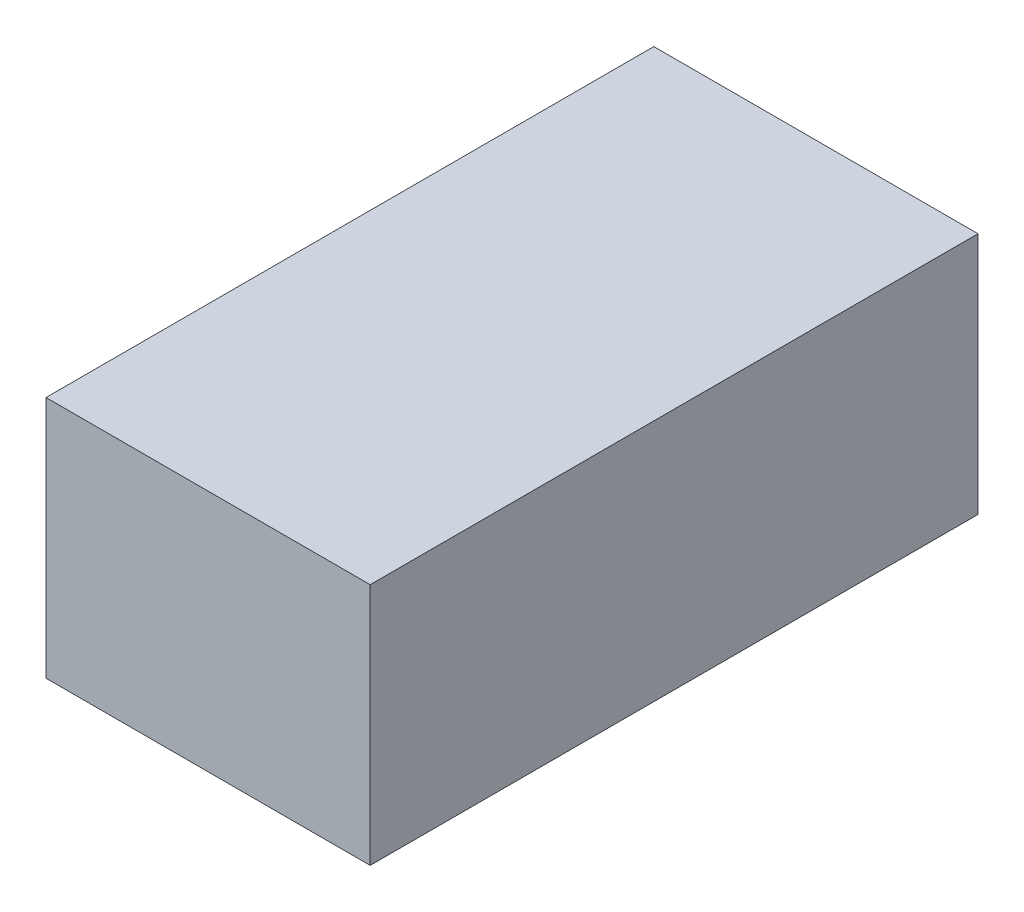
ISO-10303-21;
HEADER;
FILE_DESCRIPTION(('STEP AP214'),'2;1');
FILE_NAME('part.step','',(''),(''),'','','');
FILE_SCHEMA(('AUTOMOTIVE_DESIGN { 1 0 10303 214 1 1 1 1 }'));
ENDSEC;
DATA;
#1=APPLICATION_CONTEXT('core data for automotive mechanical design processes');
#2=APPLICATION_PROTOCOL_DEFINITION('international standard','automotive_design',2000,#1);
#3=PRODUCT_CONTEXT('',#1,'mechanical');
#4=PRODUCT('Part','Part','',(#3));
#5=PRODUCT_RELATED_PRODUCT_CATEGORY('part','',(#4));
#6=PRODUCT_DEFINITION_FORMATION('','',#4);
#7=PRODUCT_DEFINITION_CONTEXT('part definition',#1,'design');
#8=PRODUCT_DEFINITION('design','',#6,#7);
#9=PRODUCT_DEFINITION_SHAPE('','',#8);
#10=(LENGTH_UNIT() NAMED_UNIT(*) SI_UNIT(.MILLI.,.METRE.));
#11=(NAMED_UNIT(*) PLANE_ANGLE_UNIT() SI_UNIT($,.RADIAN.));
#12=(NAMED_UNIT(*) SI_UNIT($,.STERADIAN.) SOLID_ANGLE_UNIT());
#13=UNCERTAINTY_MEASURE_WITH_UNIT(LENGTH_MEASURE(1.E-05),#10,'distance_accuracy_value','');
#14=(GEOMETRIC_REPRESENTATION_CONTEXT(3) GLOBAL_UNCERTAINTY_ASSIGNED_CONTEXT((#13)) GLOBAL_UNIT_ASSIGNED_CONTEXT((#10,
#11,#12)) REPRESENTATION_CONTEXT('',''));
#15=CARTESIAN_POINT('',(0.,0.,0.));
#16=DIRECTION('',(0.,0.,1.));
#17=DIRECTION('',(1.,0.,0.));
#18=AXIS2_PLACEMENT_3D('',#15,#16,#17);
#19=CARTESIAN_POINT('',(4.,3.,-7.5));
#20=DIRECTION('',(0.,0.,1.));
#21=DIRECTION('',(0.,-1.,0.));
#22=AXIS2_PLACEMENT_3D('',#19,#20,#21);
#23=PLANE('',#22);
#24=DIRECTION('',(0.,1.,0.));
#25=VECTOR('',#24,1.);
#26=CARTESIAN_POINT('',(-4.,3.,-7.5));
#27=LINE('',#26,#25);
#28=CARTESIAN_POINT('',(-4.,-3.,-7.5));
#29=VERTEX_POINT('',#28);
#30=CARTESIAN_POINT('',(-4.,3.,-7.5));
#31=VERTEX_POINT('',#30);
#32=EDGE_CURVE('E96',#29,#31,#27,.T.);
#33=ORIENTED_EDGE('',*,*,#32,.T.);
#34=DIRECTION('',(-1.,0.,0.));
#35=VECTOR('',#34,1.);
#36=CARTESIAN_POINT('',(4.,3.,-7.5));
#37=LINE('',#36,#35);
#38=CARTESIAN_POINT('',(4.,3.,-7.5));
#39=VERTEX_POINT('',#38);
#40=EDGE_CURVE('E11',#39,#31,#37,.T.);
#41=ORIENTED_EDGE('',*,*,#40,.F.);
#42=DIRECTION('',(0.,1.,0.));
#43=VECTOR('',#42,1.);
#44=CARTESIAN_POINT('',(4.,3.,-7.5));
#45=LINE('',#44,#43);
#46=CARTESIAN_POINT('',(4.,-3.,-7.5));
#47=VERTEX_POINT('',#46);
#48=EDGE_CURVE('E84',#47,#39,#45,.T.);
#49=ORIENTED_EDGE('',*,*,#48,.F.);
#50=DIRECTION('',(-1.,0.,0.));
#51=VECTOR('',#50,1.);
#52=CARTESIAN_POINT('',(4.,-3.,-7.5));
#53=LINE('',#52,#51);
#54=EDGE_CURVE('E92',#47,#29,#53,.T.);
#55=ORIENTED_EDGE('',*,*,#54,.T.);
#56=EDGE_LOOP('',(#33,#41,#49,#55));
#57=FACE_BOUND('',#56,.T.);
#58=ADVANCED_FACE('F33',(#57),#23,.F.);
#59=CARTESIAN_POINT('',(4.,3.,7.5));
#60=DIRECTION('',(0.,-1.,0.));
#61=DIRECTION('',(0.,0.,-1.));
#62=AXIS2_PLACEMENT_3D('',#59,#60,#61);
#63=PLANE('',#62);
#64=DIRECTION('',(0.,0.,1.));
#65=VECTOR('',#64,1.);
#66=CARTESIAN_POINT('',(-4.,3.,7.5));
#67=LINE('',#66,#65);
#68=CARTESIAN_POINT('',(-4.,3.,7.5));
#69=VERTEX_POINT('',#68);
#70=EDGE_CURVE('E88',#31,#69,#67,.T.);
#71=ORIENTED_EDGE('',*,*,#70,.T.);
#72=DIRECTION('',(-1.,0.,0.));
#73=VECTOR('',#72,1.);
#74=CARTESIAN_POINT('',(4.,3.,7.5));
#75=LINE('',#74,#73);
#76=CARTESIAN_POINT('',(4.,3.,7.5));
#77=VERTEX_POINT('',#76);
#78=EDGE_CURVE('E41',#77,#69,#75,.T.);
#79=ORIENTED_EDGE('',*,*,#78,.F.);
#80=DIRECTION('',(0.,0.,1.));
#81=VECTOR('',#80,1.);
#82=CARTESIAN_POINT('',(4.,3.,7.5));
#83=LINE('',#82,#81);
#84=EDGE_CURVE('E79',#39,#77,#83,.T.);
#85=ORIENTED_EDGE('',*,*,#84,.F.);
#86=ORIENTED_EDGE('',*,*,#40,.T.);
#87=EDGE_LOOP('',(#71,#79,#85,#86));
#88=FACE_BOUND('',#87,.T.);
#89=ADVANCED_FACE('F87',(#88),#63,.F.);
#90=CARTESIAN_POINT('',(4.,3.,7.5));
#91=DIRECTION('',(0.,0.,-1.));
#92=DIRECTION('',(0.,1.,0.));
#93=AXIS2_PLACEMENT_3D('',#90,#91,#92);
#94=PLANE('',#93);
#95=DIRECTION('',(0.,-1.,0.));
#96=VECTOR('',#95,1.);
#97=CARTESIAN_POINT('',(-4.,3.,7.5));
#98=LINE('',#97,#96);
#99=CARTESIAN_POINT('',(-4.,-3.,7.49999999999999));
#100=VERTEX_POINT('',#99);
#101=EDGE_CURVE('E66',#69,#100,#98,.T.);
#102=ORIENTED_EDGE('',*,*,#101,.T.);
#103=DIRECTION('',(-1.,0.,0.));
#104=VECTOR('',#103,1.);
#105=CARTESIAN_POINT('',(4.,-3.,7.49999999999999));
#106=LINE('',#105,#104);
#107=CARTESIAN_POINT('',(4.,-3.,7.49999999999999));
#108=VERTEX_POINT('',#107);
#109=EDGE_CURVE('E89',#108,#100,#106,.T.);
#110=ORIENTED_EDGE('',*,*,#109,.F.);
#111=DIRECTION('',(0.,-1.,0.));
#112=VECTOR('',#111,1.);
#113=CARTESIAN_POINT('',(4.,3.,7.5));
#114=LINE('',#113,#112);
#115=EDGE_CURVE('E82',#77,#108,#114,.T.);
#116=ORIENTED_EDGE('',*,*,#115,.F.);
#117=ORIENTED_EDGE('',*,*,#78,.T.);
#118=EDGE_LOOP('',(#102,#110,#116,#117));
#119=FACE_BOUND('',#118,.T.);
#120=ADVANCED_FACE('F90',(#119),#94,.F.);
#121=CARTESIAN_POINT('',(4.,-3.,7.49999999999999));
#122=DIRECTION('',(0.,1.,0.));
#123=DIRECTION('',(0.,0.,1.));
#124=AXIS2_PLACEMENT_3D('',#121,#122,#123);
#125=PLANE('',#124);
#126=DIRECTION('',(0.,0.,-1.));
#127=VECTOR('',#126,1.);
#128=CARTESIAN_POINT('',(-4.,-3.,7.49999999999999));
#129=LINE('',#128,#127);
#130=EDGE_CURVE('E72',#100,#29,#129,.T.);
#131=ORIENTED_EDGE('',*,*,#130,.T.);
#132=ORIENTED_EDGE('',*,*,#54,.F.);
#133=DIRECTION('',(0.,0.,-1.));
#134=VECTOR('',#133,1.);
#135=CARTESIAN_POINT('',(4.,-3.,7.49999999999999));
#136=LINE('',#135,#134);
#137=EDGE_CURVE('E49',#108,#47,#136,.T.);
#138=ORIENTED_EDGE('',*,*,#137,.F.);
#139=ORIENTED_EDGE('',*,*,#109,.T.);
#140=EDGE_LOOP('',(#131,#132,#138,#139));
#141=FACE_BOUND('',#140,.T.);
#142=ADVANCED_FACE('F103',(#141),#125,.F.);
#143=CARTESIAN_POINT('',(4.,0.,0.));
#144=DIRECTION('',(1.,0.,0.));
#145=DIRECTION('',(0.,0.,-1.));
#146=AXIS2_PLACEMENT_3D('',#143,#144,#145);
#147=PLANE('',#146);
#148=ORIENTED_EDGE('',*,*,#48,.T.);
#149=ORIENTED_EDGE('',*,*,#84,.T.);
#150=ORIENTED_EDGE('',*,*,#115,.T.);
#151=ORIENTED_EDGE('',*,*,#137,.T.);
#152=EDGE_LOOP('',(#148,#149,#150,#151));
#153=FACE_BOUND('',#152,.T.);
#154=ADVANCED_FACE('F80',(#153),#147,.T.);
#155=CARTESIAN_POINT('',(-4.,0.,0.));
#156=DIRECTION('',(1.,0.,0.));
#157=DIRECTION('',(0.,0.,-1.));
#158=AXIS2_PLACEMENT_3D('',#155,#156,#157);
#159=PLANE('',#158);
#160=ORIENTED_EDGE('',*,*,#32,.F.);
#161=ORIENTED_EDGE('',*,*,#130,.F.);
#162=ORIENTED_EDGE('',*,*,#101,.F.);
#163=ORIENTED_EDGE('',*,*,#70,.F.);
#164=EDGE_LOOP('',(#160,#161,#162,#163));
#165=FACE_BOUND('',#164,.T.);
#166=ADVANCED_FACE('F106',(#165),#159,.F.);
#167=CLOSED_SHELL('',(#58,#89,#120,#142,#154,#166));
#168=MANIFOLD_SOLID_BREP('B2',#167);
#169=ADVANCED_BREP_SHAPE_REPRESENTATION('',(#18,#168),#14);
#170=SHAPE_DEFINITION_REPRESENTATION(#9,#169);
ENDSEC;
END-ISO-10303-21;
